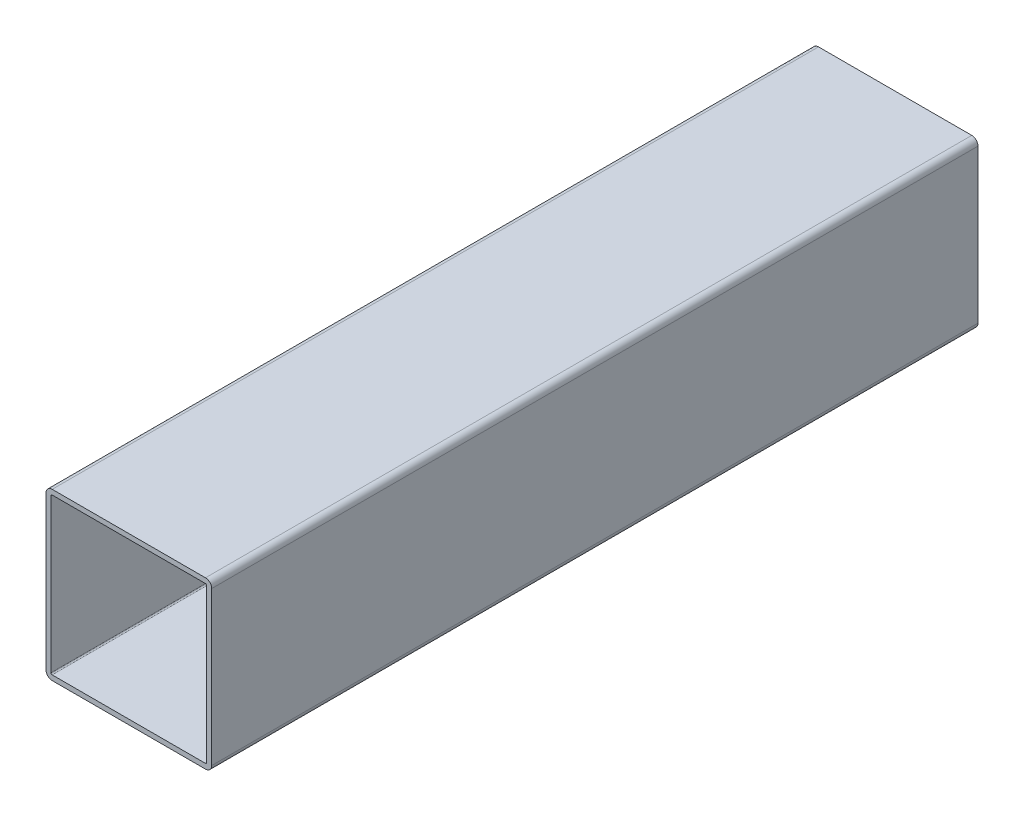
ISO-10303-21;
HEADER;
FILE_DESCRIPTION(('STEP AP214'),'2;1');
FILE_NAME('part.step','',(''),(''),'','','');
FILE_SCHEMA(('AUTOMOTIVE_DESIGN { 1 0 10303 214 1 1 1 1 }'));
ENDSEC;
DATA;
#1=APPLICATION_CONTEXT('core data for automotive mechanical design processes');
#2=APPLICATION_PROTOCOL_DEFINITION('international standard','automotive_design',2000,#1);
#3=PRODUCT_CONTEXT('',#1,'mechanical');
#4=PRODUCT('Part','Part','',(#3));
#5=PRODUCT_RELATED_PRODUCT_CATEGORY('part','',(#4));
#6=PRODUCT_DEFINITION_FORMATION('','',#4);
#7=PRODUCT_DEFINITION_CONTEXT('part definition',#1,'design');
#8=PRODUCT_DEFINITION('design','',#6,#7);
#9=PRODUCT_DEFINITION_SHAPE('','',#8);
#10=(LENGTH_UNIT() NAMED_UNIT(*) SI_UNIT(.MILLI.,.METRE.));
#11=(NAMED_UNIT(*) PLANE_ANGLE_UNIT() SI_UNIT($,.RADIAN.));
#12=(NAMED_UNIT(*) SI_UNIT($,.STERADIAN.) SOLID_ANGLE_UNIT());
#13=UNCERTAINTY_MEASURE_WITH_UNIT(LENGTH_MEASURE(1.E-05),#10,'distance_accuracy_value','');
#14=(GEOMETRIC_REPRESENTATION_CONTEXT(3) GLOBAL_UNCERTAINTY_ASSIGNED_CONTEXT((#13)) GLOBAL_UNIT_ASSIGNED_CONTEXT((#10,
#11,#12)) REPRESENTATION_CONTEXT('',''));
#15=CARTESIAN_POINT('',(0.,0.,0.));
#16=DIRECTION('',(0.,0.,1.));
#17=DIRECTION('',(1.,0.,0.));
#18=AXIS2_PLACEMENT_3D('',#15,#16,#17);
#19=CARTESIAN_POINT('',(-18.5,18.5,-185.));
#20=DIRECTION('',(0.,0.,1.));
#21=DIRECTION('',(1.,0.,0.));
#22=AXIS2_PLACEMENT_3D('',#19,#20,#21);
#23=CYLINDRICAL_SURFACE('',#22,1.5);
#24=CARTESIAN_POINT('',(-18.5,18.5,0.));
#25=DIRECTION('',(0.,0.,-1.));
#26=DIRECTION('',(-1.,0.,0.));
#27=AXIS2_PLACEMENT_3D('',#24,#25,#26);
#28=CIRCLE('',#27,1.5);
#29=CARTESIAN_POINT('',(-20.,18.5,0.));
#30=VERTEX_POINT('',#29);
#31=CARTESIAN_POINT('',(-18.5,20.,0.));
#32=VERTEX_POINT('',#31);
#33=EDGE_CURVE('E235',#30,#32,#28,.T.);
#34=ORIENTED_EDGE('',*,*,#33,.T.);
#35=DIRECTION('',(0.,0.,1.));
#36=VECTOR('',#35,1.);
#37=CARTESIAN_POINT('',(-18.5,20.,-185.));
#38=LINE('',#37,#36);
#39=CARTESIAN_POINT('',(-18.5,20.,-185.));
#40=VERTEX_POINT('',#39);
#41=EDGE_CURVE('E12',#40,#32,#38,.T.);
#42=ORIENTED_EDGE('',*,*,#41,.F.);
#43=CARTESIAN_POINT('',(-18.5,18.5,-185.));
#44=DIRECTION('',(0.,0.,-1.));
#45=DIRECTION('',(-1.,0.,0.));
#46=AXIS2_PLACEMENT_3D('',#43,#44,#45);
#47=CIRCLE('',#46,1.5);
#48=CARTESIAN_POINT('',(-20.,18.5,-185.));
#49=VERTEX_POINT('',#48);
#50=EDGE_CURVE('E313',#49,#40,#47,.T.);
#51=ORIENTED_EDGE('',*,*,#50,.F.);
#52=DIRECTION('',(0.,0.,1.));
#53=VECTOR('',#52,1.);
#54=CARTESIAN_POINT('',(-20.,18.5,-185.));
#55=LINE('',#54,#53);
#56=EDGE_CURVE('E250',#49,#30,#55,.T.);
#57=ORIENTED_EDGE('',*,*,#56,.T.);
#58=EDGE_LOOP('',(#34,#42,#51,#57));
#59=FACE_BOUND('',#58,.T.);
#60=ADVANCED_FACE('F63',(#59),#23,.T.);
#61=CARTESIAN_POINT('',(-18.5,20.,-185.));
#62=DIRECTION('',(0.,-1.,0.));
#63=DIRECTION('',(0.,0.,-1.));
#64=AXIS2_PLACEMENT_3D('',#61,#62,#63);
#65=PLANE('',#64);
#66=DIRECTION('',(1.,0.,0.));
#67=VECTOR('',#66,1.);
#68=CARTESIAN_POINT('',(-18.5,20.,0.));
#69=LINE('',#68,#67);
#70=CARTESIAN_POINT('',(18.5,20.,0.));
#71=VERTEX_POINT('',#70);
#72=EDGE_CURVE('E238',#32,#71,#69,.T.);
#73=ORIENTED_EDGE('',*,*,#72,.T.);
#74=DIRECTION('',(0.,0.,1.));
#75=VECTOR('',#74,1.);
#76=CARTESIAN_POINT('',(18.5,20.,-185.));
#77=LINE('',#76,#75);
#78=CARTESIAN_POINT('',(18.5,20.,-185.));
#79=VERTEX_POINT('',#78);
#80=EDGE_CURVE('E73',#79,#71,#77,.T.);
#81=ORIENTED_EDGE('',*,*,#80,.F.);
#82=DIRECTION('',(1.,0.,0.));
#83=VECTOR('',#82,1.);
#84=CARTESIAN_POINT('',(-18.5,20.,-185.));
#85=LINE('',#84,#83);
#86=EDGE_CURVE('E315',#40,#79,#85,.T.);
#87=ORIENTED_EDGE('',*,*,#86,.F.);
#88=ORIENTED_EDGE('',*,*,#41,.T.);
#89=EDGE_LOOP('',(#73,#81,#87,#88));
#90=FACE_BOUND('',#89,.T.);
#91=ADVANCED_FACE('F350',(#90),#65,.F.);
#92=CARTESIAN_POINT('',(18.5,18.5,-185.));
#93=DIRECTION('',(0.,0.,1.));
#94=DIRECTION('',(1.,0.,0.));
#95=AXIS2_PLACEMENT_3D('',#92,#93,#94);
#96=CYLINDRICAL_SURFACE('',#95,1.5);
#97=CARTESIAN_POINT('',(18.5,18.5,0.));
#98=DIRECTION('',(0.,0.,-1.));
#99=DIRECTION('',(-1.,0.,0.));
#100=AXIS2_PLACEMENT_3D('',#97,#98,#99);
#101=CIRCLE('',#100,1.5);
#102=CARTESIAN_POINT('',(20.,18.5,0.));
#103=VERTEX_POINT('',#102);
#104=EDGE_CURVE('E240',#71,#103,#101,.T.);
#105=ORIENTED_EDGE('',*,*,#104,.T.);
#106=DIRECTION('',(0.,0.,1.));
#107=VECTOR('',#106,1.);
#108=CARTESIAN_POINT('',(20.,18.5,-185.));
#109=LINE('',#108,#107);
#110=CARTESIAN_POINT('',(20.,18.5,-185.));
#111=VERTEX_POINT('',#110);
#112=EDGE_CURVE('E257',#111,#103,#109,.T.);
#113=ORIENTED_EDGE('',*,*,#112,.F.);
#114=CARTESIAN_POINT('',(18.5,18.5,-185.));
#115=DIRECTION('',(0.,0.,-1.));
#116=DIRECTION('',(-1.,0.,0.));
#117=AXIS2_PLACEMENT_3D('',#114,#115,#116);
#118=CIRCLE('',#117,1.5);
#119=EDGE_CURVE('E317',#79,#111,#118,.T.);
#120=ORIENTED_EDGE('',*,*,#119,.F.);
#121=ORIENTED_EDGE('',*,*,#80,.T.);
#122=EDGE_LOOP('',(#105,#113,#120,#121));
#123=FACE_BOUND('',#122,.T.);
#124=ADVANCED_FACE('F355',(#123),#96,.T.);
#125=CARTESIAN_POINT('',(20.,-18.5,-185.));
#126=DIRECTION('',(-1.,0.,0.));
#127=DIRECTION('',(0.,0.,1.));
#128=AXIS2_PLACEMENT_3D('',#125,#126,#127);
#129=PLANE('',#128);
#130=DIRECTION('',(0.,-1.,0.));
#131=VECTOR('',#130,1.);
#132=CARTESIAN_POINT('',(20.,-18.5,0.));
#133=LINE('',#132,#131);
#134=CARTESIAN_POINT('',(20.,-18.5,0.));
#135=VERTEX_POINT('',#134);
#136=EDGE_CURVE('E242',#103,#135,#133,.T.);
#137=ORIENTED_EDGE('',*,*,#136,.T.);
#138=DIRECTION('',(0.,0.,1.));
#139=VECTOR('',#138,1.);
#140=CARTESIAN_POINT('',(20.,-18.5,-185.));
#141=LINE('',#140,#139);
#142=CARTESIAN_POINT('',(20.,-18.5,-185.));
#143=VERTEX_POINT('',#142);
#144=EDGE_CURVE('E254',#143,#135,#141,.T.);
#145=ORIENTED_EDGE('',*,*,#144,.F.);
#146=DIRECTION('',(0.,-1.,0.));
#147=VECTOR('',#146,1.);
#148=CARTESIAN_POINT('',(20.,-18.5,-185.));
#149=LINE('',#148,#147);
#150=EDGE_CURVE('E319',#111,#143,#149,.T.);
#151=ORIENTED_EDGE('',*,*,#150,.F.);
#152=ORIENTED_EDGE('',*,*,#112,.T.);
#153=EDGE_LOOP('',(#137,#145,#151,#152));
#154=FACE_BOUND('',#153,.T.);
#155=ADVANCED_FACE('F325',(#154),#129,.F.);
#156=CARTESIAN_POINT('',(18.5,-18.5,-185.));
#157=DIRECTION('',(0.,0.,1.));
#158=DIRECTION('',(1.,0.,0.));
#159=AXIS2_PLACEMENT_3D('',#156,#157,#158);
#160=CYLINDRICAL_SURFACE('',#159,1.5);
#161=CARTESIAN_POINT('',(18.5,-18.5,0.));
#162=DIRECTION('',(0.,0.,-1.));
#163=DIRECTION('',(-1.,0.,0.));
#164=AXIS2_PLACEMENT_3D('',#161,#162,#163);
#165=CIRCLE('',#164,1.5);
#166=CARTESIAN_POINT('',(18.5,-20.,0.));
#167=VERTEX_POINT('',#166);
#168=EDGE_CURVE('E244',#135,#167,#165,.T.);
#169=ORIENTED_EDGE('',*,*,#168,.T.);
#170=DIRECTION('',(0.,0.,1.));
#171=VECTOR('',#170,1.);
#172=CARTESIAN_POINT('',(18.5,-20.,-185.));
#173=LINE('',#172,#171);
#174=CARTESIAN_POINT('',(18.5,-20.,-185.));
#175=VERTEX_POINT('',#174);
#176=EDGE_CURVE('E202',#175,#167,#173,.T.);
#177=ORIENTED_EDGE('',*,*,#176,.F.);
#178=CARTESIAN_POINT('',(18.5,-18.5,-185.));
#179=DIRECTION('',(0.,0.,-1.));
#180=DIRECTION('',(-1.,0.,0.));
#181=AXIS2_PLACEMENT_3D('',#178,#179,#180);
#182=CIRCLE('',#181,1.5);
#183=EDGE_CURVE('E193',#143,#175,#182,.T.);
#184=ORIENTED_EDGE('',*,*,#183,.F.);
#185=ORIENTED_EDGE('',*,*,#144,.T.);
#186=EDGE_LOOP('',(#169,#177,#184,#185));
#187=FACE_BOUND('',#186,.T.);
#188=ADVANCED_FACE('F329',(#187),#160,.T.);
#189=CARTESIAN_POINT('',(18.5,-20.,-185.));
#190=DIRECTION('',(0.,1.,0.));
#191=DIRECTION('',(0.,0.,1.));
#192=AXIS2_PLACEMENT_3D('',#189,#190,#191);
#193=PLANE('',#192);
#194=DIRECTION('',(-1.,0.,0.));
#195=VECTOR('',#194,1.);
#196=CARTESIAN_POINT('',(18.5,-20.,0.));
#197=LINE('',#196,#195);
#198=CARTESIAN_POINT('',(-18.5,-20.,0.));
#199=VERTEX_POINT('',#198);
#200=EDGE_CURVE('E201',#167,#199,#197,.T.);
#201=ORIENTED_EDGE('',*,*,#200,.T.);
#202=DIRECTION('',(0.,0.,1.));
#203=VECTOR('',#202,1.);
#204=CARTESIAN_POINT('',(-18.5,-20.,-185.));
#205=LINE('',#204,#203);
#206=CARTESIAN_POINT('',(-18.5,-20.,-185.));
#207=VERTEX_POINT('',#206);
#208=EDGE_CURVE('E198',#207,#199,#205,.T.);
#209=ORIENTED_EDGE('',*,*,#208,.F.);
#210=DIRECTION('',(-1.,0.,0.));
#211=VECTOR('',#210,1.);
#212=CARTESIAN_POINT('',(18.5,-20.,-185.));
#213=LINE('',#212,#211);
#214=EDGE_CURVE('E187',#175,#207,#213,.T.);
#215=ORIENTED_EDGE('',*,*,#214,.F.);
#216=ORIENTED_EDGE('',*,*,#176,.T.);
#217=EDGE_LOOP('',(#201,#209,#215,#216));
#218=FACE_BOUND('',#217,.T.);
#219=ADVANCED_FACE('F199',(#218),#193,.F.);
#220=CARTESIAN_POINT('',(-18.5,-18.5,-185.));
#221=DIRECTION('',(0.,0.,1.));
#222=DIRECTION('',(1.,0.,0.));
#223=AXIS2_PLACEMENT_3D('',#220,#221,#222);
#224=CYLINDRICAL_SURFACE('',#223,1.5);
#225=CARTESIAN_POINT('',(-18.5,-18.5,0.));
#226=DIRECTION('',(0.,0.,-1.));
#227=DIRECTION('',(-1.,0.,0.));
#228=AXIS2_PLACEMENT_3D('',#225,#226,#227);
#229=CIRCLE('',#228,1.5);
#230=CARTESIAN_POINT('',(-20.,-18.5,0.));
#231=VERTEX_POINT('',#230);
#232=EDGE_CURVE('E135',#199,#231,#229,.T.);
#233=ORIENTED_EDGE('',*,*,#232,.T.);
#234=DIRECTION('',(0.,0.,1.));
#235=VECTOR('',#234,1.);
#236=CARTESIAN_POINT('',(-20.,-18.5,-185.));
#237=LINE('',#236,#235);
#238=CARTESIAN_POINT('',(-20.,-18.5,-185.));
#239=VERTEX_POINT('',#238);
#240=EDGE_CURVE('E203',#239,#231,#237,.T.);
#241=ORIENTED_EDGE('',*,*,#240,.F.);
#242=CARTESIAN_POINT('',(-18.5,-18.5,-185.));
#243=DIRECTION('',(0.,0.,-1.));
#244=DIRECTION('',(-1.,0.,0.));
#245=AXIS2_PLACEMENT_3D('',#242,#243,#244);
#246=CIRCLE('',#245,1.5);
#247=EDGE_CURVE('E191',#207,#239,#246,.T.);
#248=ORIENTED_EDGE('',*,*,#247,.F.);
#249=ORIENTED_EDGE('',*,*,#208,.T.);
#250=EDGE_LOOP('',(#233,#241,#248,#249));
#251=FACE_BOUND('',#250,.T.);
#252=ADVANCED_FACE('F205',(#251),#224,.T.);
#253=CARTESIAN_POINT('',(18.5,18.5,-185.));
#254=DIRECTION('',(0.,0.,1.));
#255=DIRECTION('',(1.,0.,0.));
#256=AXIS2_PLACEMENT_3D('',#253,#254,#255);
#257=CYLINDRICAL_SURFACE('',#256,0.3);
#258=CARTESIAN_POINT('',(18.5,18.5,0.));
#259=DIRECTION('',(0.,0.,-1.));
#260=DIRECTION('',(-1.,0.,0.));
#261=AXIS2_PLACEMENT_3D('',#258,#259,#260);
#262=CIRCLE('',#261,0.3);
#263=CARTESIAN_POINT('',(18.5,18.8,0.));
#264=VERTEX_POINT('',#263);
#265=CARTESIAN_POINT('',(18.8,18.5,0.));
#266=VERTEX_POINT('',#265);
#267=EDGE_CURVE('E211',#264,#266,#262,.T.);
#268=ORIENTED_EDGE('',*,*,#267,.F.);
#269=DIRECTION('',(0.,0.,1.));
#270=VECTOR('',#269,1.);
#271=CARTESIAN_POINT('',(18.5,18.8,-185.));
#272=LINE('',#271,#270);
#273=CARTESIAN_POINT('',(18.5,18.8,-185.));
#274=VERTEX_POINT('',#273);
#275=EDGE_CURVE('E67',#274,#264,#272,.T.);
#276=ORIENTED_EDGE('',*,*,#275,.F.);
#277=CARTESIAN_POINT('',(18.5,18.5,-185.));
#278=DIRECTION('',(0.,0.,-1.));
#279=DIRECTION('',(-1.,0.,0.));
#280=AXIS2_PLACEMENT_3D('',#277,#278,#279);
#281=CIRCLE('',#280,0.3);
#282=CARTESIAN_POINT('',(18.8,18.5,-185.));
#283=VERTEX_POINT('',#282);
#284=EDGE_CURVE('E249',#274,#283,#281,.T.);
#285=ORIENTED_EDGE('',*,*,#284,.T.);
#286=DIRECTION('',(0.,0.,1.));
#287=VECTOR('',#286,1.);
#288=CARTESIAN_POINT('',(18.8,18.5,-185.));
#289=LINE('',#288,#287);
#290=EDGE_CURVE('E207',#283,#266,#289,.T.);
#291=ORIENTED_EDGE('',*,*,#290,.T.);
#292=EDGE_LOOP('',(#268,#276,#285,#291));
#293=FACE_BOUND('',#292,.T.);
#294=ADVANCED_FACE('F65',(#293),#257,.F.);
#295=CARTESIAN_POINT('',(-18.5,18.8,-185.));
#296=DIRECTION('',(0.,-1.,0.));
#297=DIRECTION('',(0.,0.,-1.));
#298=AXIS2_PLACEMENT_3D('',#295,#296,#297);
#299=PLANE('',#298);
#300=DIRECTION('',(1.,0.,0.));
#301=VECTOR('',#300,1.);
#302=CARTESIAN_POINT('',(-18.5,18.8,0.));
#303=LINE('',#302,#301);
#304=CARTESIAN_POINT('',(-18.5,18.8,0.));
#305=VERTEX_POINT('',#304);
#306=EDGE_CURVE('E214',#305,#264,#303,.T.);
#307=ORIENTED_EDGE('',*,*,#306,.F.);
#308=DIRECTION('',(0.,0.,1.));
#309=VECTOR('',#308,1.);
#310=CARTESIAN_POINT('',(-18.5,18.8,-185.));
#311=LINE('',#310,#309);
#312=CARTESIAN_POINT('',(-18.5,18.8,-185.));
#313=VERTEX_POINT('',#312);
#314=EDGE_CURVE('E272',#313,#305,#311,.T.);
#315=ORIENTED_EDGE('',*,*,#314,.F.);
#316=DIRECTION('',(1.,0.,0.));
#317=VECTOR('',#316,1.);
#318=CARTESIAN_POINT('',(-18.5,18.8,-185.));
#319=LINE('',#318,#317);
#320=EDGE_CURVE('E281',#313,#274,#319,.T.);
#321=ORIENTED_EDGE('',*,*,#320,.T.);
#322=ORIENTED_EDGE('',*,*,#275,.T.);
#323=EDGE_LOOP('',(#307,#315,#321,#322));
#324=FACE_BOUND('',#323,.T.);
#325=ADVANCED_FACE('F279',(#324),#299,.T.);
#326=CARTESIAN_POINT('',(-18.5,18.5,-185.));
#327=DIRECTION('',(0.,0.,1.));
#328=DIRECTION('',(1.,0.,0.));
#329=AXIS2_PLACEMENT_3D('',#326,#327,#328);
#330=CYLINDRICAL_SURFACE('',#329,0.3);
#331=CARTESIAN_POINT('',(-18.5,18.5,0.));
#332=DIRECTION('',(0.,0.,-1.));
#333=DIRECTION('',(-1.,0.,0.));
#334=AXIS2_PLACEMENT_3D('',#331,#332,#333);
#335=CIRCLE('',#334,0.3);
#336=CARTESIAN_POINT('',(-18.8,18.5,0.));
#337=VERTEX_POINT('',#336);
#338=EDGE_CURVE('E217',#337,#305,#335,.T.);
#339=ORIENTED_EDGE('',*,*,#338,.F.);
#340=DIRECTION('',(0.,0.,1.));
#341=VECTOR('',#340,1.);
#342=CARTESIAN_POINT('',(-18.8,18.5,-185.));
#343=LINE('',#342,#341);
#344=CARTESIAN_POINT('',(-18.8,18.5,-185.));
#345=VERTEX_POINT('',#344);
#346=EDGE_CURVE('E271',#345,#337,#343,.T.);
#347=ORIENTED_EDGE('',*,*,#346,.F.);
#348=CARTESIAN_POINT('',(-18.5,18.5,-185.));
#349=DIRECTION('',(0.,0.,-1.));
#350=DIRECTION('',(-1.,0.,0.));
#351=AXIS2_PLACEMENT_3D('',#348,#349,#350);
#352=CIRCLE('',#351,0.3);
#353=EDGE_CURVE('E289',#345,#313,#352,.T.);
#354=ORIENTED_EDGE('',*,*,#353,.T.);
#355=ORIENTED_EDGE('',*,*,#314,.T.);
#356=EDGE_LOOP('',(#339,#347,#354,#355));
#357=FACE_BOUND('',#356,.T.);
#358=ADVANCED_FACE('F287',(#357),#330,.F.);
#359=CARTESIAN_POINT('',(-18.8,18.5,-185.));
#360=DIRECTION('',(1.,0.,0.));
#361=DIRECTION('',(0.,0.,-1.));
#362=AXIS2_PLACEMENT_3D('',#359,#360,#361);
#363=PLANE('',#362);
#364=DIRECTION('',(0.,1.,0.));
#365=VECTOR('',#364,1.);
#366=CARTESIAN_POINT('',(-18.8,18.5,0.));
#367=LINE('',#366,#365);
#368=CARTESIAN_POINT('',(-18.8,-18.5,0.));
#369=VERTEX_POINT('',#368);
#370=EDGE_CURVE('E220',#369,#337,#367,.T.);
#371=ORIENTED_EDGE('',*,*,#370,.F.);
#372=DIRECTION('',(0.,0.,1.));
#373=VECTOR('',#372,1.);
#374=CARTESIAN_POINT('',(-18.8,-18.5,-185.));
#375=LINE('',#374,#373);
#376=CARTESIAN_POINT('',(-18.8,-18.5,-185.));
#377=VERTEX_POINT('',#376);
#378=EDGE_CURVE('E269',#377,#369,#375,.T.);
#379=ORIENTED_EDGE('',*,*,#378,.F.);
#380=DIRECTION('',(0.,1.,0.));
#381=VECTOR('',#380,1.);
#382=CARTESIAN_POINT('',(-18.8,18.5,-185.));
#383=LINE('',#382,#381);
#384=EDGE_CURVE('E295',#377,#345,#383,.T.);
#385=ORIENTED_EDGE('',*,*,#384,.T.);
#386=ORIENTED_EDGE('',*,*,#346,.T.);
#387=EDGE_LOOP('',(#371,#379,#385,#386));
#388=FACE_BOUND('',#387,.T.);
#389=ADVANCED_FACE('F298',(#388),#363,.T.);
#390=CARTESIAN_POINT('',(-18.5,-18.5,-185.));
#391=DIRECTION('',(0.,0.,1.));
#392=DIRECTION('',(1.,0.,0.));
#393=AXIS2_PLACEMENT_3D('',#390,#391,#392);
#394=CYLINDRICAL_SURFACE('',#393,0.300000000000005);
#395=CARTESIAN_POINT('',(-18.5,-18.5,0.));
#396=DIRECTION('',(0.,0.,-1.));
#397=DIRECTION('',(-1.,0.,0.));
#398=AXIS2_PLACEMENT_3D('',#395,#396,#397);
#399=CIRCLE('',#398,0.300000000000005);
#400=CARTESIAN_POINT('',(-18.5,-18.8,0.));
#401=VERTEX_POINT('',#400);
#402=EDGE_CURVE('E223',#401,#369,#399,.T.);
#403=ORIENTED_EDGE('',*,*,#402,.F.);
#404=DIRECTION('',(0.,0.,1.));
#405=VECTOR('',#404,1.);
#406=CARTESIAN_POINT('',(-18.5,-18.8,-185.));
#407=LINE('',#406,#405);
#408=CARTESIAN_POINT('',(-18.5,-18.8,-185.));
#409=VERTEX_POINT('',#408);
#410=EDGE_CURVE('E267',#409,#401,#407,.T.);
#411=ORIENTED_EDGE('',*,*,#410,.F.);
#412=CARTESIAN_POINT('',(-18.5,-18.5,-185.));
#413=DIRECTION('',(0.,0.,-1.));
#414=DIRECTION('',(-1.,0.,0.));
#415=AXIS2_PLACEMENT_3D('',#412,#413,#414);
#416=CIRCLE('',#415,0.300000000000005);
#417=EDGE_CURVE('E299',#409,#377,#416,.T.);
#418=ORIENTED_EDGE('',*,*,#417,.T.);
#419=ORIENTED_EDGE('',*,*,#378,.T.);
#420=EDGE_LOOP('',(#403,#411,#418,#419));
#421=FACE_BOUND('',#420,.T.);
#422=ADVANCED_FACE('F366',(#421),#394,.F.);
#423=CARTESIAN_POINT('',(18.5,-18.8,-185.));
#424=DIRECTION('',(0.,1.,0.));
#425=DIRECTION('',(0.,0.,1.));
#426=AXIS2_PLACEMENT_3D('',#423,#424,#425);
#427=PLANE('',#426);
#428=DIRECTION('',(-1.,0.,0.));
#429=VECTOR('',#428,1.);
#430=CARTESIAN_POINT('',(18.5,-18.8,0.));
#431=LINE('',#430,#429);
#432=CARTESIAN_POINT('',(18.5,-18.8,0.));
#433=VERTEX_POINT('',#432);
#434=EDGE_CURVE('E226',#433,#401,#431,.T.);
#435=ORIENTED_EDGE('',*,*,#434,.F.);
#436=DIRECTION('',(0.,0.,1.));
#437=VECTOR('',#436,1.);
#438=CARTESIAN_POINT('',(18.5,-18.8,-185.));
#439=LINE('',#438,#437);
#440=CARTESIAN_POINT('',(18.5,-18.8,-185.));
#441=VERTEX_POINT('',#440);
#442=EDGE_CURVE('E265',#441,#433,#439,.T.);
#443=ORIENTED_EDGE('',*,*,#442,.F.);
#444=DIRECTION('',(-1.,0.,0.));
#445=VECTOR('',#444,1.);
#446=CARTESIAN_POINT('',(18.5,-18.8,-185.));
#447=LINE('',#446,#445);
#448=EDGE_CURVE('E301',#441,#409,#447,.T.);
#449=ORIENTED_EDGE('',*,*,#448,.T.);
#450=ORIENTED_EDGE('',*,*,#410,.T.);
#451=EDGE_LOOP('',(#435,#443,#449,#450));
#452=FACE_BOUND('',#451,.T.);
#453=ADVANCED_FACE('F362',(#452),#427,.T.);
#454=CARTESIAN_POINT('',(18.5,-18.5,-185.));
#455=DIRECTION('',(0.,0.,1.));
#456=DIRECTION('',(1.,0.,0.));
#457=AXIS2_PLACEMENT_3D('',#454,#455,#456);
#458=CYLINDRICAL_SURFACE('',#457,0.300000000000003);
#459=CARTESIAN_POINT('',(18.5,-18.5,0.));
#460=DIRECTION('',(0.,0.,-1.));
#461=DIRECTION('',(-1.,0.,0.));
#462=AXIS2_PLACEMENT_3D('',#459,#460,#461);
#463=CIRCLE('',#462,0.300000000000003);
#464=CARTESIAN_POINT('',(18.8,-18.5,0.));
#465=VERTEX_POINT('',#464);
#466=EDGE_CURVE('E229',#465,#433,#463,.T.);
#467=ORIENTED_EDGE('',*,*,#466,.F.);
#468=DIRECTION('',(0.,0.,1.));
#469=VECTOR('',#468,1.);
#470=CARTESIAN_POINT('',(18.8,-18.5,-185.));
#471=LINE('',#470,#469);
#472=CARTESIAN_POINT('',(18.8,-18.5,-185.));
#473=VERTEX_POINT('',#472);
#474=EDGE_CURVE('E263',#473,#465,#471,.T.);
#475=ORIENTED_EDGE('',*,*,#474,.F.);
#476=CARTESIAN_POINT('',(18.5,-18.5,-185.));
#477=DIRECTION('',(0.,0.,-1.));
#478=DIRECTION('',(-1.,0.,0.));
#479=AXIS2_PLACEMENT_3D('',#476,#477,#478);
#480=CIRCLE('',#479,0.300000000000003);
#481=EDGE_CURVE('E307',#473,#441,#480,.T.);
#482=ORIENTED_EDGE('',*,*,#481,.T.);
#483=ORIENTED_EDGE('',*,*,#442,.T.);
#484=EDGE_LOOP('',(#467,#475,#482,#483));
#485=FACE_BOUND('',#484,.T.);
#486=ADVANCED_FACE('F344',(#485),#458,.F.);
#487=CARTESIAN_POINT('',(18.8,-18.5,-185.));
#488=DIRECTION('',(-1.,0.,0.));
#489=DIRECTION('',(0.,0.,1.));
#490=AXIS2_PLACEMENT_3D('',#487,#488,#489);
#491=PLANE('',#490);
#492=DIRECTION('',(0.,-1.,0.));
#493=VECTOR('',#492,1.);
#494=CARTESIAN_POINT('',(18.8,-18.5,0.));
#495=LINE('',#494,#493);
#496=EDGE_CURVE('E232',#266,#465,#495,.T.);
#497=ORIENTED_EDGE('',*,*,#496,.F.);
#498=ORIENTED_EDGE('',*,*,#290,.F.);
#499=DIRECTION('',(0.,-1.,0.));
#500=VECTOR('',#499,1.);
#501=CARTESIAN_POINT('',(18.8,-18.5,-185.));
#502=LINE('',#501,#500);
#503=EDGE_CURVE('E310',#283,#473,#502,.T.);
#504=ORIENTED_EDGE('',*,*,#503,.T.);
#505=ORIENTED_EDGE('',*,*,#474,.T.);
#506=EDGE_LOOP('',(#497,#498,#504,#505));
#507=FACE_BOUND('',#506,.T.);
#508=ADVANCED_FACE('F337',(#507),#491,.T.);
#509=CARTESIAN_POINT('',(-20.,18.5,-185.));
#510=DIRECTION('',(1.,0.,0.));
#511=DIRECTION('',(0.,0.,-1.));
#512=AXIS2_PLACEMENT_3D('',#509,#510,#511);
#513=PLANE('',#512);
#514=DIRECTION('',(0.,1.,0.));
#515=VECTOR('',#514,1.);
#516=CARTESIAN_POINT('',(-20.,18.5,0.));
#517=LINE('',#516,#515);
#518=EDGE_CURVE('E141',#231,#30,#517,.T.);
#519=ORIENTED_EDGE('',*,*,#518,.T.);
#520=ORIENTED_EDGE('',*,*,#56,.F.);
#521=DIRECTION('',(0.,1.,0.));
#522=VECTOR('',#521,1.);
#523=CARTESIAN_POINT('',(-20.,18.5,-185.));
#524=LINE('',#523,#522);
#525=EDGE_CURVE('E82',#239,#49,#524,.T.);
#526=ORIENTED_EDGE('',*,*,#525,.F.);
#527=ORIENTED_EDGE('',*,*,#240,.T.);
#528=EDGE_LOOP('',(#519,#520,#526,#527));
#529=FACE_BOUND('',#528,.T.);
#530=ADVANCED_FACE('F335',(#529),#513,.F.);
#531=CARTESIAN_POINT('',(-18.5,18.5,-185.));
#532=DIRECTION('',(0.,0.,-1.));
#533=DIRECTION('',(-1.,0.,0.));
#534=AXIS2_PLACEMENT_3D('',#531,#532,#533);
#535=PLANE('',#534);
#536=ORIENTED_EDGE('',*,*,#284,.F.);
#537=ORIENTED_EDGE('',*,*,#320,.F.);
#538=ORIENTED_EDGE('',*,*,#353,.F.);
#539=ORIENTED_EDGE('',*,*,#384,.F.);
#540=ORIENTED_EDGE('',*,*,#417,.F.);
#541=ORIENTED_EDGE('',*,*,#448,.F.);
#542=ORIENTED_EDGE('',*,*,#481,.F.);
#543=ORIENTED_EDGE('',*,*,#503,.F.);
#544=EDGE_LOOP('',(#536,#537,#538,#539,#540,#541,#542,#543));
#545=FACE_BOUND('',#544,.T.);
#546=ORIENTED_EDGE('',*,*,#50,.T.);
#547=ORIENTED_EDGE('',*,*,#86,.T.);
#548=ORIENTED_EDGE('',*,*,#119,.T.);
#549=ORIENTED_EDGE('',*,*,#150,.T.);
#550=ORIENTED_EDGE('',*,*,#183,.T.);
#551=ORIENTED_EDGE('',*,*,#214,.T.);
#552=ORIENTED_EDGE('',*,*,#247,.T.);
#553=ORIENTED_EDGE('',*,*,#525,.T.);
#554=EDGE_LOOP('',(#546,#547,#548,#549,#550,#551,#552,#553));
#555=FACE_BOUND('',#554,.T.);
#556=ADVANCED_FACE('F189',(#545,#555),#535,.T.);
#557=CARTESIAN_POINT('',(-18.5,18.5,0.));
#558=DIRECTION('',(0.,0.,-1.));
#559=DIRECTION('',(-1.,0.,0.));
#560=AXIS2_PLACEMENT_3D('',#557,#558,#559);
#561=PLANE('',#560);
#562=ORIENTED_EDGE('',*,*,#267,.T.);
#563=ORIENTED_EDGE('',*,*,#496,.T.);
#564=ORIENTED_EDGE('',*,*,#466,.T.);
#565=ORIENTED_EDGE('',*,*,#434,.T.);
#566=ORIENTED_EDGE('',*,*,#402,.T.);
#567=ORIENTED_EDGE('',*,*,#370,.T.);
#568=ORIENTED_EDGE('',*,*,#338,.T.);
#569=ORIENTED_EDGE('',*,*,#306,.T.);
#570=EDGE_LOOP('',(#562,#563,#564,#565,#566,#567,#568,#569));
#571=FACE_BOUND('',#570,.T.);
#572=ORIENTED_EDGE('',*,*,#33,.F.);
#573=ORIENTED_EDGE('',*,*,#518,.F.);
#574=ORIENTED_EDGE('',*,*,#232,.F.);
#575=ORIENTED_EDGE('',*,*,#200,.F.);
#576=ORIENTED_EDGE('',*,*,#168,.F.);
#577=ORIENTED_EDGE('',*,*,#136,.F.);
#578=ORIENTED_EDGE('',*,*,#104,.F.);
#579=ORIENTED_EDGE('',*,*,#72,.F.);
#580=EDGE_LOOP('',(#572,#573,#574,#575,#576,#577,#578,#579));
#581=FACE_BOUND('',#580,.T.);
#582=ADVANCED_FACE('F284',(#571,#581),#561,.F.);
#583=CLOSED_SHELL('',(#60,#91,#124,#155,#188,#219,#252,#294,#325,#358,#389,#422,#453,#486,#508,
#530,#556,#582));
#584=MANIFOLD_SOLID_BREP('B2',#583);
#585=ADVANCED_BREP_SHAPE_REPRESENTATION('',(#18,#584),#14);
#586=SHAPE_DEFINITION_REPRESENTATION(#9,#585);
ENDSEC;
END-ISO-10303-21;
